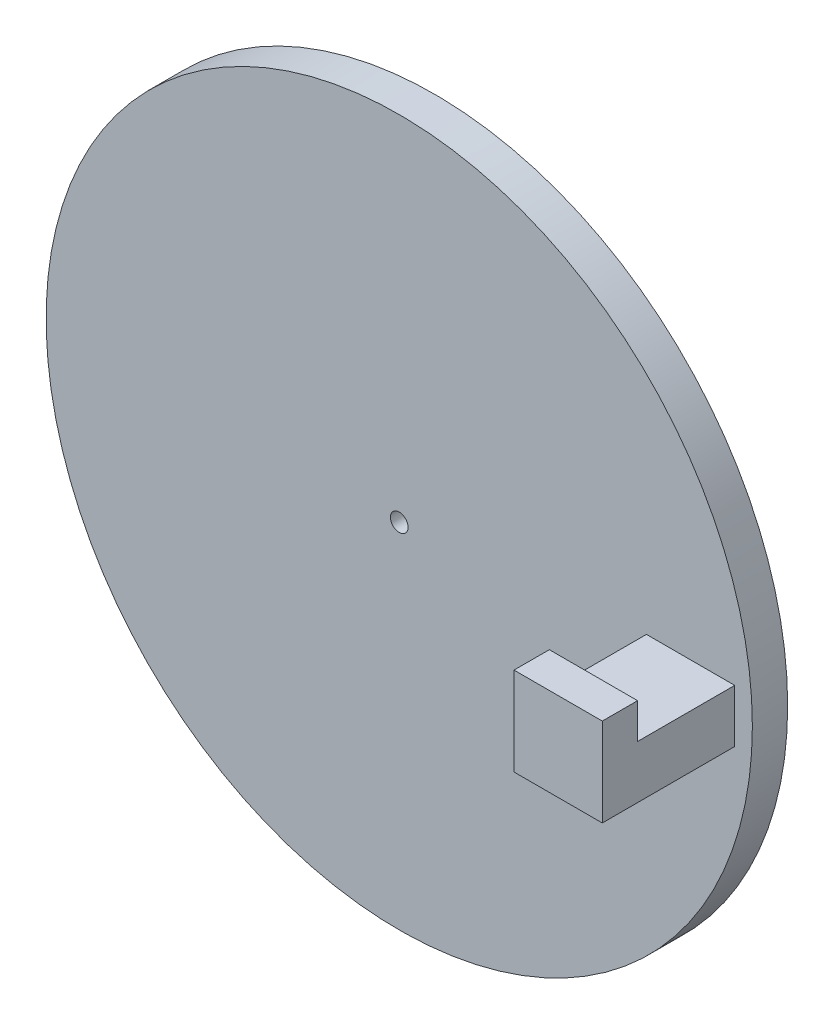
ISO-10303-21;
HEADER;
FILE_DESCRIPTION(('STEP AP214'),'2;1');
FILE_NAME('part.step','',(''),(''),'','','');
FILE_SCHEMA(('AUTOMOTIVE_DESIGN { 1 0 10303 214 1 1 1 1 }'));
ENDSEC;
DATA;
#1=APPLICATION_CONTEXT('core data for automotive mechanical design processes');
#2=APPLICATION_PROTOCOL_DEFINITION('international standard','automotive_design',2000,#1);
#3=PRODUCT_CONTEXT('',#1,'mechanical');
#4=PRODUCT('Part','Part','',(#3));
#5=PRODUCT_RELATED_PRODUCT_CATEGORY('part','',(#4));
#6=PRODUCT_DEFINITION_FORMATION('','',#4);
#7=PRODUCT_DEFINITION_CONTEXT('part definition',#1,'design');
#8=PRODUCT_DEFINITION('design','',#6,#7);
#9=PRODUCT_DEFINITION_SHAPE('','',#8);
#10=(LENGTH_UNIT() NAMED_UNIT(*) SI_UNIT(.MILLI.,.METRE.));
#11=(NAMED_UNIT(*) PLANE_ANGLE_UNIT() SI_UNIT($,.RADIAN.));
#12=(NAMED_UNIT(*) SI_UNIT($,.STERADIAN.) SOLID_ANGLE_UNIT());
#13=UNCERTAINTY_MEASURE_WITH_UNIT(LENGTH_MEASURE(1.E-05),#10,'distance_accuracy_value','');
#14=(GEOMETRIC_REPRESENTATION_CONTEXT(3) GLOBAL_UNCERTAINTY_ASSIGNED_CONTEXT((#13)) GLOBAL_UNIT_ASSIGNED_CONTEXT((#10,
#11,#12)) REPRESENTATION_CONTEXT('',''));
#15=CARTESIAN_POINT('',(0.,0.,0.));
#16=DIRECTION('',(0.,0.,1.));
#17=DIRECTION('',(1.,0.,0.));
#18=AXIS2_PLACEMENT_3D('',#15,#16,#17);
#19=CARTESIAN_POINT('',(35.56,3.81,24.13));
#20=DIRECTION('',(0.,-1.,0.));
#21=DIRECTION('',(0.,0.,-1.));
#22=AXIS2_PLACEMENT_3D('',#19,#20,#21);
#23=PLANE('',#22);
#24=DIRECTION('',(-1.,0.,0.));
#25=VECTOR('',#24,1.);
#26=CARTESIAN_POINT('',(35.56,3.81,19.05));
#27=LINE('',#26,#25);
#28=CARTESIAN_POINT('',(48.26,3.81,19.05));
#29=VERTEX_POINT('',#28);
#30=CARTESIAN_POINT('',(35.56,3.81,19.05));
#31=VERTEX_POINT('',#30);
#32=EDGE_CURVE('E183',#29,#31,#27,.T.);
#33=ORIENTED_EDGE('',*,*,#32,.F.);
#34=DIRECTION('',(0.,0.,-1.));
#35=VECTOR('',#34,1.);
#36=CARTESIAN_POINT('',(48.26,3.81,24.13));
#37=LINE('',#36,#35);
#38=CARTESIAN_POINT('',(48.26,3.81,5.08));
#39=VERTEX_POINT('',#38);
#40=EDGE_CURVE('E55',#29,#39,#37,.T.);
#41=ORIENTED_EDGE('',*,*,#40,.T.);
#42=DIRECTION('',(-1.,0.,0.));
#43=VECTOR('',#42,1.);
#44=CARTESIAN_POINT('',(35.56,3.81,5.08));
#45=LINE('',#44,#43);
#46=CARTESIAN_POINT('',(35.56,3.81,5.08));
#47=VERTEX_POINT('',#46);
#48=EDGE_CURVE('E95',#39,#47,#45,.T.);
#49=ORIENTED_EDGE('',*,*,#48,.T.);
#50=DIRECTION('',(0.,0.,-1.));
#51=VECTOR('',#50,1.);
#52=CARTESIAN_POINT('',(35.56,3.81,24.13));
#53=LINE('',#52,#51);
#54=EDGE_CURVE('E81',#31,#47,#53,.T.);
#55=ORIENTED_EDGE('',*,*,#54,.F.);
#56=EDGE_LOOP('',(#33,#41,#49,#55));
#57=FACE_BOUND('',#56,.T.);
#58=ADVANCED_FACE('F39',(#57),#23,.F.);
#59=CARTESIAN_POINT('',(0.,0.,5.08));
#60=DIRECTION('',(0.,0.,1.));
#61=DIRECTION('',(1.,0.,0.));
#62=AXIS2_PLACEMENT_3D('',#59,#60,#61);
#63=PLANE('',#62);
#64=CARTESIAN_POINT('',(0.,0.,5.08));
#65=DIRECTION('',(0.,0.,1.));
#66=DIRECTION('',(1.,0.,0.));
#67=AXIS2_PLACEMENT_3D('',#64,#65,#66);
#68=CIRCLE('',#67,50.8);
#69=CARTESIAN_POINT('',(50.8,0.,5.08));
#70=VERTEX_POINT('',#69);
#71=EDGE_CURVE('E11',#70,#70,#68,.T.);
#72=ORIENTED_EDGE('',*,*,#71,.T.);
#73=EDGE_LOOP('',(#72));
#74=FACE_BOUND('',#73,.T.);
#75=CARTESIAN_POINT('',(0.,0.,5.08));
#76=DIRECTION('',(0.,0.,1.));
#77=DIRECTION('',(1.,0.,0.));
#78=AXIS2_PLACEMENT_3D('',#75,#76,#77);
#79=CIRCLE('',#78,1.27);
#80=CARTESIAN_POINT('',(1.27,0.,5.08));
#81=VERTEX_POINT('',#80);
#82=EDGE_CURVE('E127',#81,#81,#79,.T.);
#83=ORIENTED_EDGE('',*,*,#82,.F.);
#84=EDGE_LOOP('',(#83));
#85=FACE_BOUND('',#84,.T.);
#86=DIRECTION('',(1.,0.,0.));
#87=VECTOR('',#86,1.);
#88=CARTESIAN_POINT('',(35.56,-3.81,5.08));
#89=LINE('',#88,#87);
#90=CARTESIAN_POINT('',(35.56,-3.81,5.08));
#91=VERTEX_POINT('',#90);
#92=CARTESIAN_POINT('',(48.26,-3.81,5.08));
#93=VERTEX_POINT('',#92);
#94=EDGE_CURVE('E103',#91,#93,#89,.T.);
#95=ORIENTED_EDGE('',*,*,#94,.F.);
#96=DIRECTION('',(0.,-1.,0.));
#97=VECTOR('',#96,1.);
#98=CARTESIAN_POINT('',(35.56,-3.81,5.08));
#99=LINE('',#98,#97);
#100=EDGE_CURVE('E85',#47,#91,#99,.T.);
#101=ORIENTED_EDGE('',*,*,#100,.F.);
#102=ORIENTED_EDGE('',*,*,#48,.F.);
#103=DIRECTION('',(0.,1.,0.));
#104=VECTOR('',#103,1.);
#105=CARTESIAN_POINT('',(48.26,-3.81,5.08));
#106=LINE('',#105,#104);
#107=EDGE_CURVE('E100',#93,#39,#106,.T.);
#108=ORIENTED_EDGE('',*,*,#107,.F.);
#109=EDGE_LOOP('',(#95,#101,#102,#108));
#110=FACE_BOUND('',#109,.T.);
#111=ADVANCED_FACE('F102',(#74,#85,#110),#63,.T.);
#112=CARTESIAN_POINT('',(0.,0.,0.));
#113=DIRECTION('',(0.,0.,1.));
#114=DIRECTION('',(1.,0.,0.));
#115=AXIS2_PLACEMENT_3D('',#112,#113,#114);
#116=PLANE('',#115);
#117=CARTESIAN_POINT('',(0.,0.,0.));
#118=DIRECTION('',(0.,0.,1.));
#119=DIRECTION('',(1.,0.,0.));
#120=AXIS2_PLACEMENT_3D('',#117,#118,#119);
#121=CIRCLE('',#120,50.8);
#122=CARTESIAN_POINT('',(50.8,0.,0.));
#123=VERTEX_POINT('',#122);
#124=EDGE_CURVE('E43',#123,#123,#121,.T.);
#125=ORIENTED_EDGE('',*,*,#124,.F.);
#126=EDGE_LOOP('',(#125));
#127=FACE_BOUND('',#126,.T.);
#128=CARTESIAN_POINT('',(0.,0.,0.));
#129=DIRECTION('',(0.,0.,1.));
#130=DIRECTION('',(1.,0.,0.));
#131=AXIS2_PLACEMENT_3D('',#128,#129,#130);
#132=CIRCLE('',#131,1.27);
#133=CARTESIAN_POINT('',(1.27,0.,0.));
#134=VERTEX_POINT('',#133);
#135=EDGE_CURVE('E126',#134,#134,#132,.T.);
#136=ORIENTED_EDGE('',*,*,#135,.T.);
#137=EDGE_LOOP('',(#136));
#138=FACE_BOUND('',#137,.T.);
#139=ADVANCED_FACE('F135',(#127,#138),#116,.F.);
#140=CARTESIAN_POINT('',(0.,0.,5.08));
#141=DIRECTION('',(0.,0.,-1.));
#142=DIRECTION('',(-1.,0.,0.));
#143=AXIS2_PLACEMENT_3D('',#140,#141,#142);
#144=CYLINDRICAL_SURFACE('',#143,50.8);
#145=ORIENTED_EDGE('',*,*,#71,.F.);
#146=EDGE_LOOP('',(#145));
#147=FACE_BOUND('',#146,.T.);
#148=ORIENTED_EDGE('',*,*,#124,.T.);
#149=EDGE_LOOP('',(#148));
#150=FACE_BOUND('',#149,.T.);
#151=ADVANCED_FACE('F41',(#147,#150),#144,.T.);
#152=CARTESIAN_POINT('',(0.,0.,5.08));
#153=DIRECTION('',(0.,0.,-1.));
#154=DIRECTION('',(-1.,0.,0.));
#155=AXIS2_PLACEMENT_3D('',#152,#153,#154);
#156=CYLINDRICAL_SURFACE('',#155,1.27);
#157=ORIENTED_EDGE('',*,*,#82,.T.);
#158=EDGE_LOOP('',(#157));
#159=FACE_BOUND('',#158,.T.);
#160=ORIENTED_EDGE('',*,*,#135,.F.);
#161=EDGE_LOOP('',(#160));
#162=FACE_BOUND('',#161,.T.);
#163=ADVANCED_FACE('F137',(#159,#162),#156,.F.);
#164=CARTESIAN_POINT('',(35.56,-3.81,24.13));
#165=DIRECTION('',(1.,0.,0.));
#166=DIRECTION('',(0.,0.,-1.));
#167=AXIS2_PLACEMENT_3D('',#164,#165,#166);
#168=PLANE('',#167);
#169=ORIENTED_EDGE('',*,*,#100,.T.);
#170=DIRECTION('',(0.,0.,-1.));
#171=VECTOR('',#170,1.);
#172=CARTESIAN_POINT('',(35.56,-3.81,24.13));
#173=LINE('',#172,#171);
#174=CARTESIAN_POINT('',(35.56,-3.81,24.13));
#175=VERTEX_POINT('',#174);
#176=EDGE_CURVE('E123',#175,#91,#173,.T.);
#177=ORIENTED_EDGE('',*,*,#176,.F.);
#178=DIRECTION('',(0.,-1.,0.));
#179=VECTOR('',#178,1.);
#180=CARTESIAN_POINT('',(35.56,-3.81,24.13));
#181=LINE('',#180,#179);
#182=CARTESIAN_POINT('',(35.56,8.89,24.13));
#183=VERTEX_POINT('',#182);
#184=EDGE_CURVE('E99',#183,#175,#181,.T.);
#185=ORIENTED_EDGE('',*,*,#184,.F.);
#186=DIRECTION('',(0.,0.,1.));
#187=VECTOR('',#186,1.);
#188=CARTESIAN_POINT('',(35.56,8.89,24.13));
#189=LINE('',#188,#187);
#190=CARTESIAN_POINT('',(35.56,8.89,19.05));
#191=VERTEX_POINT('',#190);
#192=EDGE_CURVE('E187',#191,#183,#189,.T.);
#193=ORIENTED_EDGE('',*,*,#192,.F.);
#194=DIRECTION('',(0.,-1.,0.));
#195=VECTOR('',#194,1.);
#196=CARTESIAN_POINT('',(35.56,8.89,19.05));
#197=LINE('',#196,#195);
#198=EDGE_CURVE('E90',#191,#31,#197,.T.);
#199=ORIENTED_EDGE('',*,*,#198,.T.);
#200=ORIENTED_EDGE('',*,*,#54,.T.);
#201=EDGE_LOOP('',(#169,#177,#185,#193,#199,#200));
#202=FACE_BOUND('',#201,.T.);
#203=ADVANCED_FACE('F82',(#202),#168,.F.);
#204=CARTESIAN_POINT('',(35.56,-3.81,24.13));
#205=DIRECTION('',(0.,1.,0.));
#206=DIRECTION('',(0.,0.,1.));
#207=AXIS2_PLACEMENT_3D('',#204,#205,#206);
#208=PLANE('',#207);
#209=ORIENTED_EDGE('',*,*,#94,.T.);
#210=DIRECTION('',(0.,0.,-1.));
#211=VECTOR('',#210,1.);
#212=CARTESIAN_POINT('',(48.26,-3.81,24.13));
#213=LINE('',#212,#211);
#214=CARTESIAN_POINT('',(48.26,-3.81,24.13));
#215=VERTEX_POINT('',#214);
#216=EDGE_CURVE('E119',#215,#93,#213,.T.);
#217=ORIENTED_EDGE('',*,*,#216,.F.);
#218=DIRECTION('',(1.,0.,0.));
#219=VECTOR('',#218,1.);
#220=CARTESIAN_POINT('',(35.56,-3.81,24.13));
#221=LINE('',#220,#219);
#222=EDGE_CURVE('E64',#175,#215,#221,.T.);
#223=ORIENTED_EDGE('',*,*,#222,.F.);
#224=ORIENTED_EDGE('',*,*,#176,.T.);
#225=EDGE_LOOP('',(#209,#217,#223,#224));
#226=FACE_BOUND('',#225,.T.);
#227=ADVANCED_FACE('F145',(#226),#208,.F.);
#228=CARTESIAN_POINT('',(48.26,-3.81,24.13));
#229=DIRECTION('',(-1.,0.,0.));
#230=DIRECTION('',(0.,0.,1.));
#231=AXIS2_PLACEMENT_3D('',#228,#229,#230);
#232=PLANE('',#231);
#233=ORIENTED_EDGE('',*,*,#107,.T.);
#234=ORIENTED_EDGE('',*,*,#40,.F.);
#235=DIRECTION('',(0.,-1.,0.));
#236=VECTOR('',#235,1.);
#237=CARTESIAN_POINT('',(48.26,8.89,19.05));
#238=LINE('',#237,#236);
#239=CARTESIAN_POINT('',(48.26,8.89,19.05));
#240=VERTEX_POINT('',#239);
#241=EDGE_CURVE('E105',#240,#29,#238,.T.);
#242=ORIENTED_EDGE('',*,*,#241,.F.);
#243=DIRECTION('',(0.,0.,-1.));
#244=VECTOR('',#243,1.);
#245=CARTESIAN_POINT('',(48.26,8.89,24.13));
#246=LINE('',#245,#244);
#247=CARTESIAN_POINT('',(48.26,8.89,24.13));
#248=VERTEX_POINT('',#247);
#249=EDGE_CURVE('E172',#248,#240,#246,.T.);
#250=ORIENTED_EDGE('',*,*,#249,.F.);
#251=DIRECTION('',(0.,1.,0.));
#252=VECTOR('',#251,1.);
#253=CARTESIAN_POINT('',(48.26,-3.81,24.13));
#254=LINE('',#253,#252);
#255=EDGE_CURVE('E92',#215,#248,#254,.T.);
#256=ORIENTED_EDGE('',*,*,#255,.F.);
#257=ORIENTED_EDGE('',*,*,#216,.T.);
#258=EDGE_LOOP('',(#233,#234,#242,#250,#256,#257));
#259=FACE_BOUND('',#258,.T.);
#260=ADVANCED_FACE('F159',(#259),#232,.F.);
#261=CARTESIAN_POINT('',(0.,0.,24.13));
#262=DIRECTION('',(0.,0.,-1.));
#263=DIRECTION('',(-1.,0.,0.));
#264=AXIS2_PLACEMENT_3D('',#261,#262,#263);
#265=PLANE('',#264);
#266=ORIENTED_EDGE('',*,*,#184,.T.);
#267=ORIENTED_EDGE('',*,*,#222,.T.);
#268=ORIENTED_EDGE('',*,*,#255,.T.);
#269=DIRECTION('',(1.,0.,0.));
#270=VECTOR('',#269,1.);
#271=CARTESIAN_POINT('',(35.56,8.89,24.13));
#272=LINE('',#271,#270);
#273=EDGE_CURVE('E193',#183,#248,#272,.T.);
#274=ORIENTED_EDGE('',*,*,#273,.F.);
#275=EDGE_LOOP('',(#266,#267,#268,#274));
#276=FACE_BOUND('',#275,.T.);
#277=ADVANCED_FACE('F157',(#276),#265,.F.);
#278=CARTESIAN_POINT('',(35.56,8.89,19.05));
#279=DIRECTION('',(0.,0.,1.));
#280=DIRECTION('',(1.,0.,0.));
#281=AXIS2_PLACEMENT_3D('',#278,#279,#280);
#282=PLANE('',#281);
#283=ORIENTED_EDGE('',*,*,#32,.T.);
#284=ORIENTED_EDGE('',*,*,#198,.F.);
#285=DIRECTION('',(-1.,0.,0.));
#286=VECTOR('',#285,1.);
#287=CARTESIAN_POINT('',(35.56,8.89,19.05));
#288=LINE('',#287,#286);
#289=EDGE_CURVE('E182',#240,#191,#288,.T.);
#290=ORIENTED_EDGE('',*,*,#289,.F.);
#291=ORIENTED_EDGE('',*,*,#241,.T.);
#292=EDGE_LOOP('',(#283,#284,#290,#291));
#293=FACE_BOUND('',#292,.T.);
#294=ADVANCED_FACE('F211',(#293),#282,.F.);
#295=CARTESIAN_POINT('',(0.,8.89,0.));
#296=DIRECTION('',(0.,-1.,0.));
#297=DIRECTION('',(0.,0.,-1.));
#298=AXIS2_PLACEMENT_3D('',#295,#296,#297);
#299=PLANE('',#298);
#300=ORIENTED_EDGE('',*,*,#192,.T.);
#301=ORIENTED_EDGE('',*,*,#273,.T.);
#302=ORIENTED_EDGE('',*,*,#249,.T.);
#303=ORIENTED_EDGE('',*,*,#289,.T.);
#304=EDGE_LOOP('',(#300,#301,#302,#303));
#305=FACE_BOUND('',#304,.T.);
#306=ADVANCED_FACE('F200',(#305),#299,.F.);
#307=CLOSED_SHELL('',(#58,#111,#139,#151,#163,#203,#227,#260,#277,#294,#306));
#308=MANIFOLD_SOLID_BREP('B2',#307);
#309=ADVANCED_BREP_SHAPE_REPRESENTATION('',(#18,#308),#14);
#310=SHAPE_DEFINITION_REPRESENTATION(#9,#309);
ENDSEC;
END-ISO-10303-21;
